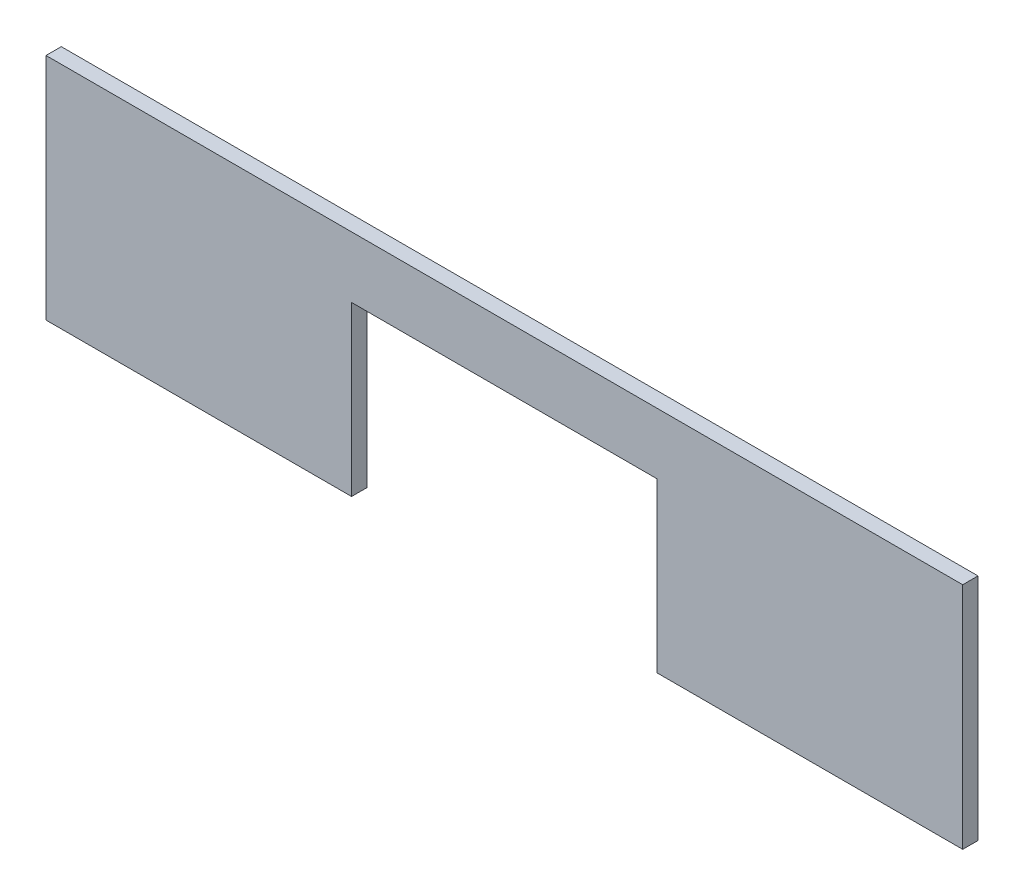
ISO-10303-21;
HEADER;
FILE_DESCRIPTION(('STEP AP214'),'2;1');
FILE_NAME('part.step','',(''),(''),'','','');
FILE_SCHEMA(('AUTOMOTIVE_DESIGN { 1 0 10303 214 1 1 1 1 }'));
ENDSEC;
DATA;
#1=APPLICATION_CONTEXT('core data for automotive mechanical design processes');
#2=APPLICATION_PROTOCOL_DEFINITION('international standard','automotive_design',2000,#1);
#3=PRODUCT_CONTEXT('',#1,'mechanical');
#4=PRODUCT('Part','Part','',(#3));
#5=PRODUCT_RELATED_PRODUCT_CATEGORY('part','',(#4));
#6=PRODUCT_DEFINITION_FORMATION('','',#4);
#7=PRODUCT_DEFINITION_CONTEXT('part definition',#1,'design');
#8=PRODUCT_DEFINITION('design','',#6,#7);
#9=PRODUCT_DEFINITION_SHAPE('','',#8);
#10=(LENGTH_UNIT() NAMED_UNIT(*) SI_UNIT(.MILLI.,.METRE.));
#11=(NAMED_UNIT(*) PLANE_ANGLE_UNIT() SI_UNIT($,.RADIAN.));
#12=(NAMED_UNIT(*) SI_UNIT($,.STERADIAN.) SOLID_ANGLE_UNIT());
#13=UNCERTAINTY_MEASURE_WITH_UNIT(LENGTH_MEASURE(1.E-05),#10,'distance_accuracy_value','');
#14=(GEOMETRIC_REPRESENTATION_CONTEXT(3) GLOBAL_UNCERTAINTY_ASSIGNED_CONTEXT((#13)) GLOBAL_UNIT_ASSIGNED_CONTEXT((#10,
#11,#12)) REPRESENTATION_CONTEXT('',''));
#15=CARTESIAN_POINT('',(0.,0.,0.));
#16=DIRECTION('',(0.,0.,1.));
#17=DIRECTION('',(1.,0.,0.));
#18=AXIS2_PLACEMENT_3D('',#15,#16,#17);
#19=CARTESIAN_POINT('',(100.,0.,10.));
#20=DIRECTION('',(-1.,0.,0.));
#21=DIRECTION('',(0.,0.,1.));
#22=AXIS2_PLACEMENT_3D('',#19,#20,#21);
#23=PLANE('',#22);
#24=DIRECTION('',(0.,1.,0.));
#25=VECTOR('',#24,1.);
#26=CARTESIAN_POINT('',(100.,0.,0.));
#27=LINE('',#26,#25);
#28=CARTESIAN_POINT('',(100.,-75.,0.));
#29=VERTEX_POINT('',#28);
#30=CARTESIAN_POINT('',(100.,35.,0.));
#31=VERTEX_POINT('',#30);
#32=EDGE_CURVE('E141',#29,#31,#27,.T.);
#33=ORIENTED_EDGE('',*,*,#32,.F.);
#34=DIRECTION('',(0.,0.,-1.));
#35=VECTOR('',#34,1.);
#36=CARTESIAN_POINT('',(100.,-75.,10.));
#37=LINE('',#36,#35);
#38=CARTESIAN_POINT('',(100.,-75.,10.));
#39=VERTEX_POINT('',#38);
#40=EDGE_CURVE('E11',#39,#29,#37,.T.);
#41=ORIENTED_EDGE('',*,*,#40,.F.);
#42=DIRECTION('',(0.,1.,0.));
#43=VECTOR('',#42,1.);
#44=CARTESIAN_POINT('',(100.,0.,10.));
#45=LINE('',#44,#43);
#46=CARTESIAN_POINT('',(100.,35.,10.));
#47=VERTEX_POINT('',#46);
#48=EDGE_CURVE('E165',#39,#47,#45,.T.);
#49=ORIENTED_EDGE('',*,*,#48,.T.);
#50=DIRECTION('',(0.,0.,-1.));
#51=VECTOR('',#50,1.);
#52=CARTESIAN_POINT('',(100.,35.,10.));
#53=LINE('',#52,#51);
#54=EDGE_CURVE('E93',#47,#31,#53,.T.);
#55=ORIENTED_EDGE('',*,*,#54,.T.);
#56=EDGE_LOOP('',(#33,#41,#49,#55));
#57=FACE_BOUND('',#56,.T.);
#58=ADVANCED_FACE('F41',(#57),#23,.T.);
#59=CARTESIAN_POINT('',(0.,-75.,10.));
#60=DIRECTION('',(0.,1.,0.));
#61=DIRECTION('',(0.,0.,1.));
#62=AXIS2_PLACEMENT_3D('',#59,#60,#61);
#63=PLANE('',#62);
#64=DIRECTION('',(1.,0.,0.));
#65=VECTOR('',#64,1.);
#66=CARTESIAN_POINT('',(0.,-75.,0.));
#67=LINE('',#66,#65);
#68=CARTESIAN_POINT('',(300.,-75.,0.));
#69=VERTEX_POINT('',#68);
#70=EDGE_CURVE('E145',#29,#69,#67,.T.);
#71=ORIENTED_EDGE('',*,*,#70,.T.);
#72=DIRECTION('',(0.,0.,-1.));
#73=VECTOR('',#72,1.);
#74=CARTESIAN_POINT('',(300.,-75.,10.));
#75=LINE('',#74,#73);
#76=CARTESIAN_POINT('',(300.,-75.,10.));
#77=VERTEX_POINT('',#76);
#78=EDGE_CURVE('E50',#77,#69,#75,.T.);
#79=ORIENTED_EDGE('',*,*,#78,.F.);
#80=DIRECTION('',(1.,0.,0.));
#81=VECTOR('',#80,1.);
#82=CARTESIAN_POINT('',(0.,-75.,10.));
#83=LINE('',#82,#81);
#84=EDGE_CURVE('E124',#39,#77,#83,.T.);
#85=ORIENTED_EDGE('',*,*,#84,.F.);
#86=ORIENTED_EDGE('',*,*,#40,.T.);
#87=EDGE_LOOP('',(#71,#79,#85,#86));
#88=FACE_BOUND('',#87,.T.);
#89=ADVANCED_FACE('F203',(#88),#63,.F.);
#90=CARTESIAN_POINT('',(300.,0.,10.));
#91=DIRECTION('',(-1.,0.,0.));
#92=DIRECTION('',(0.,0.,1.));
#93=AXIS2_PLACEMENT_3D('',#90,#91,#92);
#94=PLANE('',#93);
#95=DIRECTION('',(0.,1.,0.));
#96=VECTOR('',#95,1.);
#97=CARTESIAN_POINT('',(300.,0.,0.));
#98=LINE('',#97,#96);
#99=CARTESIAN_POINT('',(300.,75.,0.));
#100=VERTEX_POINT('',#99);
#101=EDGE_CURVE('E148',#69,#100,#98,.T.);
#102=ORIENTED_EDGE('',*,*,#101,.T.);
#103=DIRECTION('',(0.,0.,-1.));
#104=VECTOR('',#103,1.);
#105=CARTESIAN_POINT('',(300.,75.,10.));
#106=LINE('',#105,#104);
#107=CARTESIAN_POINT('',(300.,75.,10.));
#108=VERTEX_POINT('',#107);
#109=EDGE_CURVE('E175',#108,#100,#106,.T.);
#110=ORIENTED_EDGE('',*,*,#109,.F.);
#111=DIRECTION('',(0.,1.,0.));
#112=VECTOR('',#111,1.);
#113=CARTESIAN_POINT('',(300.,0.,10.));
#114=LINE('',#113,#112);
#115=EDGE_CURVE('E185',#77,#108,#114,.T.);
#116=ORIENTED_EDGE('',*,*,#115,.F.);
#117=ORIENTED_EDGE('',*,*,#78,.T.);
#118=EDGE_LOOP('',(#102,#110,#116,#117));
#119=FACE_BOUND('',#118,.T.);
#120=ADVANCED_FACE('F183',(#119),#94,.F.);
#121=CARTESIAN_POINT('',(0.,75.,10.));
#122=DIRECTION('',(0.,1.,0.));
#123=DIRECTION('',(0.,0.,1.));
#124=AXIS2_PLACEMENT_3D('',#121,#122,#123);
#125=PLANE('',#124);
#126=DIRECTION('',(1.,0.,0.));
#127=VECTOR('',#126,1.);
#128=CARTESIAN_POINT('',(0.,75.,0.));
#129=LINE('',#128,#127);
#130=CARTESIAN_POINT('',(-300.,75.,0.));
#131=VERTEX_POINT('',#130);
#132=EDGE_CURVE('E152',#131,#100,#129,.T.);
#133=ORIENTED_EDGE('',*,*,#132,.F.);
#134=DIRECTION('',(0.,0.,-1.));
#135=VECTOR('',#134,1.);
#136=CARTESIAN_POINT('',(-300.,75.,10.));
#137=LINE('',#136,#135);
#138=CARTESIAN_POINT('',(-300.,75.,10.));
#139=VERTEX_POINT('',#138);
#140=EDGE_CURVE('E172',#139,#131,#137,.T.);
#141=ORIENTED_EDGE('',*,*,#140,.F.);
#142=DIRECTION('',(1.,0.,0.));
#143=VECTOR('',#142,1.);
#144=CARTESIAN_POINT('',(0.,75.,10.));
#145=LINE('',#144,#143);
#146=EDGE_CURVE('E195',#139,#108,#145,.T.);
#147=ORIENTED_EDGE('',*,*,#146,.T.);
#148=ORIENTED_EDGE('',*,*,#109,.T.);
#149=EDGE_LOOP('',(#133,#141,#147,#148));
#150=FACE_BOUND('',#149,.T.);
#151=ADVANCED_FACE('F193',(#150),#125,.T.);
#152=CARTESIAN_POINT('',(-300.,0.,10.));
#153=DIRECTION('',(-1.,0.,0.));
#154=DIRECTION('',(0.,0.,1.));
#155=AXIS2_PLACEMENT_3D('',#152,#153,#154);
#156=PLANE('',#155);
#157=DIRECTION('',(0.,1.,0.));
#158=VECTOR('',#157,1.);
#159=CARTESIAN_POINT('',(-300.,0.,0.));
#160=LINE('',#159,#158);
#161=CARTESIAN_POINT('',(-300.,-75.,0.));
#162=VERTEX_POINT('',#161);
#163=EDGE_CURVE('E156',#162,#131,#160,.T.);
#164=ORIENTED_EDGE('',*,*,#163,.F.);
#165=DIRECTION('',(0.,0.,-1.));
#166=VECTOR('',#165,1.);
#167=CARTESIAN_POINT('',(-300.,-75.,10.));
#168=LINE('',#167,#166);
#169=CARTESIAN_POINT('',(-300.,-75.,10.));
#170=VERTEX_POINT('',#169);
#171=EDGE_CURVE('E130',#170,#162,#168,.T.);
#172=ORIENTED_EDGE('',*,*,#171,.F.);
#173=DIRECTION('',(0.,1.,0.));
#174=VECTOR('',#173,1.);
#175=CARTESIAN_POINT('',(-300.,0.,10.));
#176=LINE('',#175,#174);
#177=EDGE_CURVE('E120',#170,#139,#176,.T.);
#178=ORIENTED_EDGE('',*,*,#177,.T.);
#179=ORIENTED_EDGE('',*,*,#140,.T.);
#180=EDGE_LOOP('',(#164,#172,#178,#179));
#181=FACE_BOUND('',#180,.T.);
#182=ADVANCED_FACE('F213',(#181),#156,.T.);
#183=CARTESIAN_POINT('',(-100.,-75.,0.));
#184=VERTEX_POINT('',#183);
#185=EDGE_CURVE('E128',#162,#184,#67,.T.);
#186=ORIENTED_EDGE('',*,*,#185,.T.);
#187=DIRECTION('',(0.,0.,-1.));
#188=VECTOR('',#187,1.);
#189=CARTESIAN_POINT('',(-100.,-75.,10.));
#190=LINE('',#189,#188);
#191=CARTESIAN_POINT('',(-100.,-75.,10.));
#192=VERTEX_POINT('',#191);
#193=EDGE_CURVE('E125',#192,#184,#190,.T.);
#194=ORIENTED_EDGE('',*,*,#193,.F.);
#195=EDGE_CURVE('E113',#170,#192,#83,.T.);
#196=ORIENTED_EDGE('',*,*,#195,.F.);
#197=ORIENTED_EDGE('',*,*,#171,.T.);
#198=EDGE_LOOP('',(#186,#194,#196,#197));
#199=FACE_BOUND('',#198,.T.);
#200=ADVANCED_FACE('F126',(#199),#63,.F.);
#201=CARTESIAN_POINT('',(-100.,0.,10.));
#202=DIRECTION('',(-1.,0.,0.));
#203=DIRECTION('',(0.,0.,1.));
#204=AXIS2_PLACEMENT_3D('',#201,#202,#203);
#205=PLANE('',#204);
#206=DIRECTION('',(0.,1.,0.));
#207=VECTOR('',#206,1.);
#208=CARTESIAN_POINT('',(-100.,0.,0.));
#209=LINE('',#208,#207);
#210=CARTESIAN_POINT('',(-100.,35.,0.));
#211=VERTEX_POINT('',#210);
#212=EDGE_CURVE('E86',#184,#211,#209,.T.);
#213=ORIENTED_EDGE('',*,*,#212,.T.);
#214=DIRECTION('',(0.,0.,-1.));
#215=VECTOR('',#214,1.);
#216=CARTESIAN_POINT('',(-100.,35.,10.));
#217=LINE('',#216,#215);
#218=CARTESIAN_POINT('',(-100.,35.,10.));
#219=VERTEX_POINT('',#218);
#220=EDGE_CURVE('E131',#219,#211,#217,.T.);
#221=ORIENTED_EDGE('',*,*,#220,.F.);
#222=DIRECTION('',(0.,1.,0.));
#223=VECTOR('',#222,1.);
#224=CARTESIAN_POINT('',(-100.,0.,10.));
#225=LINE('',#224,#223);
#226=EDGE_CURVE('E117',#192,#219,#225,.T.);
#227=ORIENTED_EDGE('',*,*,#226,.F.);
#228=ORIENTED_EDGE('',*,*,#193,.T.);
#229=EDGE_LOOP('',(#213,#221,#227,#228));
#230=FACE_BOUND('',#229,.T.);
#231=ADVANCED_FACE('F133',(#230),#205,.F.);
#232=CARTESIAN_POINT('',(0.,35.,10.));
#233=DIRECTION('',(0.,1.,0.));
#234=DIRECTION('',(0.,0.,1.));
#235=AXIS2_PLACEMENT_3D('',#232,#233,#234);
#236=PLANE('',#235);
#237=DIRECTION('',(1.,0.,0.));
#238=VECTOR('',#237,1.);
#239=CARTESIAN_POINT('',(0.,35.,0.));
#240=LINE('',#239,#238);
#241=EDGE_CURVE('E162',#211,#31,#240,.T.);
#242=ORIENTED_EDGE('',*,*,#241,.T.);
#243=ORIENTED_EDGE('',*,*,#54,.F.);
#244=DIRECTION('',(1.,0.,0.));
#245=VECTOR('',#244,1.);
#246=CARTESIAN_POINT('',(0.,35.,10.));
#247=LINE('',#246,#245);
#248=EDGE_CURVE('E58',#219,#47,#247,.T.);
#249=ORIENTED_EDGE('',*,*,#248,.F.);
#250=ORIENTED_EDGE('',*,*,#220,.T.);
#251=EDGE_LOOP('',(#242,#243,#249,#250));
#252=FACE_BOUND('',#251,.T.);
#253=ADVANCED_FACE('F218',(#252),#236,.F.);
#254=CARTESIAN_POINT('',(0.,0.,10.));
#255=DIRECTION('',(0.,0.,1.));
#256=DIRECTION('',(1.,0.,0.));
#257=AXIS2_PLACEMENT_3D('',#254,#255,#256);
#258=PLANE('',#257);
#259=ORIENTED_EDGE('',*,*,#48,.F.);
#260=ORIENTED_EDGE('',*,*,#84,.T.);
#261=ORIENTED_EDGE('',*,*,#115,.T.);
#262=ORIENTED_EDGE('',*,*,#146,.F.);
#263=ORIENTED_EDGE('',*,*,#177,.F.);
#264=ORIENTED_EDGE('',*,*,#195,.T.);
#265=ORIENTED_EDGE('',*,*,#226,.T.);
#266=ORIENTED_EDGE('',*,*,#248,.T.);
#267=EDGE_LOOP('',(#259,#260,#261,#262,#263,#264,#265,#266));
#268=FACE_BOUND('',#267,.T.);
#269=ADVANCED_FACE('F115',(#268),#258,.T.);
#270=CARTESIAN_POINT('',(0.,0.,0.));
#271=DIRECTION('',(0.,0.,1.));
#272=DIRECTION('',(1.,0.,0.));
#273=AXIS2_PLACEMENT_3D('',#270,#271,#272);
#274=PLANE('',#273);
#275=ORIENTED_EDGE('',*,*,#32,.T.);
#276=ORIENTED_EDGE('',*,*,#241,.F.);
#277=ORIENTED_EDGE('',*,*,#212,.F.);
#278=ORIENTED_EDGE('',*,*,#185,.F.);
#279=ORIENTED_EDGE('',*,*,#163,.T.);
#280=ORIENTED_EDGE('',*,*,#132,.T.);
#281=ORIENTED_EDGE('',*,*,#101,.F.);
#282=ORIENTED_EDGE('',*,*,#70,.F.);
#283=EDGE_LOOP('',(#275,#276,#277,#278,#279,#280,#281,#282));
#284=FACE_BOUND('',#283,.T.);
#285=ADVANCED_FACE('F189',(#284),#274,.F.);
#286=CLOSED_SHELL('',(#58,#89,#120,#151,#182,#200,#231,#253,#269,#285));
#287=MANIFOLD_SOLID_BREP('B2',#286);
#288=ADVANCED_BREP_SHAPE_REPRESENTATION('',(#18,#287),#14);
#289=SHAPE_DEFINITION_REPRESENTATION(#9,#288);
ENDSEC;
END-ISO-10303-21;
